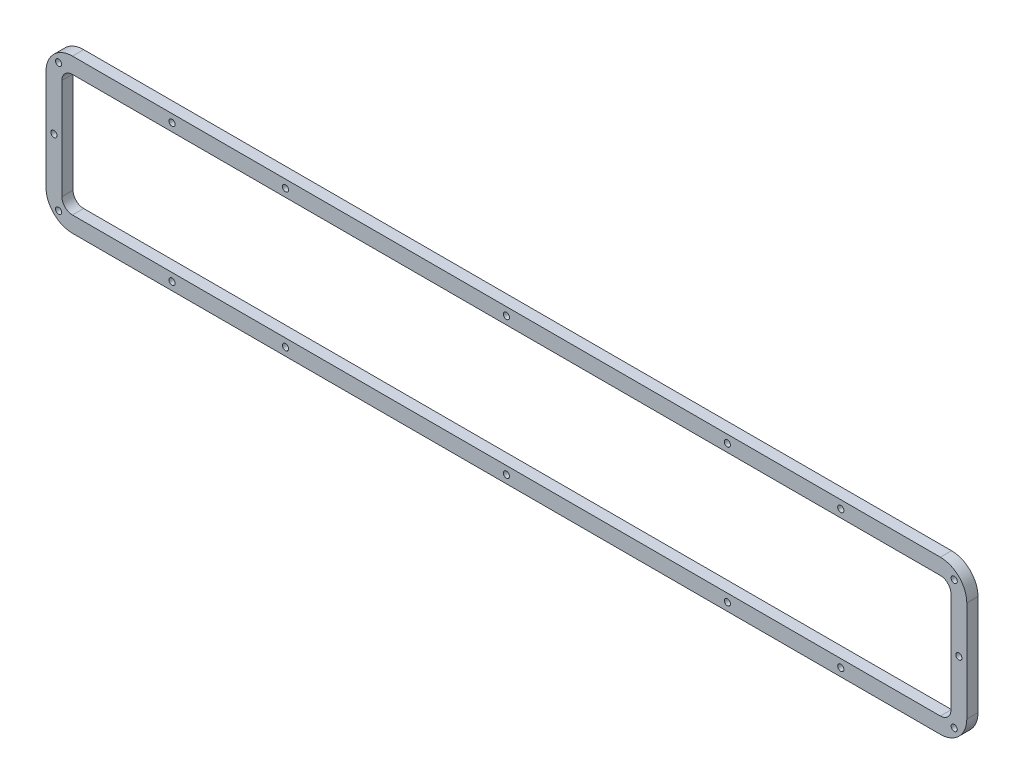
ISO-10303-21;
HEADER;
FILE_DESCRIPTION(('STEP AP214'),'2;1');
FILE_NAME('part.step','',(''),(''),'','','');
FILE_SCHEMA(('AUTOMOTIVE_DESIGN { 1 0 10303 214 1 1 1 1 }'));
ENDSEC;
DATA;
#1=APPLICATION_CONTEXT('core data for automotive mechanical design processes');
#2=APPLICATION_PROTOCOL_DEFINITION('international standard','automotive_design',2000,#1);
#3=PRODUCT_CONTEXT('',#1,'mechanical');
#4=PRODUCT('Part','Part','',(#3));
#5=PRODUCT_RELATED_PRODUCT_CATEGORY('part','',(#4));
#6=PRODUCT_DEFINITION_FORMATION('','',#4);
#7=PRODUCT_DEFINITION_CONTEXT('part definition',#1,'design');
#8=PRODUCT_DEFINITION('design','',#6,#7);
#9=PRODUCT_DEFINITION_SHAPE('','',#8);
#10=(LENGTH_UNIT() NAMED_UNIT(*) SI_UNIT(.MILLI.,.METRE.));
#11=(NAMED_UNIT(*) PLANE_ANGLE_UNIT() SI_UNIT($,.RADIAN.));
#12=(NAMED_UNIT(*) SI_UNIT($,.STERADIAN.) SOLID_ANGLE_UNIT());
#13=UNCERTAINTY_MEASURE_WITH_UNIT(LENGTH_MEASURE(1.E-05),#10,'distance_accuracy_value','');
#14=(GEOMETRIC_REPRESENTATION_CONTEXT(3) GLOBAL_UNCERTAINTY_ASSIGNED_CONTEXT((#13)) GLOBAL_UNIT_ASSIGNED_CONTEXT((#10,
#11,#12)) REPRESENTATION_CONTEXT('',''));
#15=CARTESIAN_POINT('',(0.,0.,0.));
#16=DIRECTION('',(0.,0.,1.));
#17=DIRECTION('',(1.,0.,0.));
#18=AXIS2_PLACEMENT_3D('',#15,#16,#17);
#19=CARTESIAN_POINT('',(-492.,-57.,12.7));
#20=DIRECTION('',(0.,0.,1.));
#21=DIRECTION('',(1.,0.,0.));
#22=AXIS2_PLACEMENT_3D('',#19,#20,#21);
#23=PLANE('',#22);
#24=CARTESIAN_POINT('',(513.,0.,12.7));
#25=DIRECTION('',(0.,0.,1.));
#26=DIRECTION('',(1.,0.,0.));
#27=AXIS2_PLACEMENT_3D('',#24,#25,#26);
#28=CIRCLE('',#27,3.50000000000008);
#29=CARTESIAN_POINT('',(516.5,0.,12.7));
#30=VERTEX_POINT('',#29);
#31=EDGE_CURVE('E474',#30,#30,#28,.T.);
#32=ORIENTED_EDGE('',*,*,#31,.F.);
#33=EDGE_LOOP('',(#32));
#34=FACE_BOUND('',#33,.T.);
#35=CARTESIAN_POINT('',(379.113961030679,-77.9999999999998,12.7));
#36=DIRECTION('',(0.,0.,1.));
#37=DIRECTION('',(1.,0.,0.));
#38=AXIS2_PLACEMENT_3D('',#35,#36,#37);
#39=CIRCLE('',#38,3.50000000000002);
#40=CARTESIAN_POINT('',(382.613961030679,-77.9999999999998,12.7));
#41=VERTEX_POINT('',#40);
#42=EDGE_CURVE('E471',#41,#41,#39,.T.);
#43=ORIENTED_EDGE('',*,*,#42,.F.);
#44=EDGE_LOOP('',(#43));
#45=FACE_BOUND('',#44,.T.);
#46=CARTESIAN_POINT('',(379.113961030679,78.0000000000001,12.7));
#47=DIRECTION('',(0.,0.,1.));
#48=DIRECTION('',(1.,0.,0.));
#49=AXIS2_PLACEMENT_3D('',#46,#47,#48);
#50=CIRCLE('',#49,3.50000000000002);
#51=CARTESIAN_POINT('',(382.613961030679,78.0000000000001,12.7));
#52=VERTEX_POINT('',#51);
#53=EDGE_CURVE('E468',#52,#52,#50,.T.);
#54=ORIENTED_EDGE('',*,*,#53,.F.);
#55=EDGE_LOOP('',(#54));
#56=FACE_BOUND('',#55,.T.);
#57=CARTESIAN_POINT('',(0.,78.,12.7));
#58=DIRECTION('',(0.,0.,1.));
#59=DIRECTION('',(1.,0.,0.));
#60=AXIS2_PLACEMENT_3D('',#57,#58,#59);
#61=CIRCLE('',#60,3.50000000000001);
#62=CARTESIAN_POINT('',(3.50000000000001,78.,12.7));
#63=VERTEX_POINT('',#62);
#64=EDGE_CURVE('E465',#63,#63,#61,.T.);
#65=ORIENTED_EDGE('',*,*,#64,.F.);
#66=EDGE_LOOP('',(#65));
#67=FACE_BOUND('',#66,.T.);
#68=CARTESIAN_POINT('',(0.,-77.9999999999999,12.7));
#69=DIRECTION('',(0.,0.,1.));
#70=DIRECTION('',(1.,0.,0.));
#71=AXIS2_PLACEMENT_3D('',#68,#69,#70);
#72=CIRCLE('',#71,3.50000000000001);
#73=CARTESIAN_POINT('',(3.50000000000001,-77.9999999999999,12.7));
#74=VERTEX_POINT('',#73);
#75=EDGE_CURVE('E462',#74,#74,#72,.T.);
#76=ORIENTED_EDGE('',*,*,#75,.F.);
#77=EDGE_LOOP('',(#76));
#78=FACE_BOUND('',#77,.T.);
#79=CARTESIAN_POINT('',(-379.113961030679,-77.9999999999999,12.7));
#80=DIRECTION('',(0.,0.,1.));
#81=DIRECTION('',(1.,0.,0.));
#82=AXIS2_PLACEMENT_3D('',#79,#80,#81);
#83=CIRCLE('',#82,3.50000000000002);
#84=CARTESIAN_POINT('',(-375.613961030679,-77.9999999999999,12.7));
#85=VERTEX_POINT('',#84);
#86=EDGE_CURVE('E459',#85,#85,#83,.T.);
#87=ORIENTED_EDGE('',*,*,#86,.F.);
#88=EDGE_LOOP('',(#87));
#89=FACE_BOUND('',#88,.T.);
#90=CARTESIAN_POINT('',(-513.,0.,12.7));
#91=DIRECTION('',(0.,0.,1.));
#92=DIRECTION('',(1.,0.,0.));
#93=AXIS2_PLACEMENT_3D('',#90,#91,#92);
#94=CIRCLE('',#93,3.49999999999996);
#95=CARTESIAN_POINT('',(-509.5,0.,12.7));
#96=VERTEX_POINT('',#95);
#97=EDGE_CURVE('E427',#96,#96,#94,.T.);
#98=ORIENTED_EDGE('',*,*,#97,.F.);
#99=EDGE_LOOP('',(#98));
#100=FACE_BOUND('',#99,.T.);
#101=CARTESIAN_POINT('',(-379.113961030679,78.,12.7));
#102=DIRECTION('',(0.,0.,1.));
#103=DIRECTION('',(1.,0.,0.));
#104=AXIS2_PLACEMENT_3D('',#101,#102,#103);
#105=CIRCLE('',#104,3.50000000000002);
#106=CARTESIAN_POINT('',(-375.613961030679,78.,12.7));
#107=VERTEX_POINT('',#106);
#108=EDGE_CURVE('E436',#107,#107,#105,.T.);
#109=ORIENTED_EDGE('',*,*,#108,.F.);
#110=EDGE_LOOP('',(#109));
#111=FACE_BOUND('',#110,.T.);
#112=CARTESIAN_POINT('',(-507.727922061358,-72.7279220613577,12.7));
#113=DIRECTION('',(0.,0.,1.));
#114=DIRECTION('',(1.,0.,0.));
#115=AXIS2_PLACEMENT_3D('',#112,#113,#114);
#116=CIRCLE('',#115,3.50000000000008);
#117=CARTESIAN_POINT('',(-504.227922061358,-72.7279220613577,12.7));
#118=VERTEX_POINT('',#117);
#119=EDGE_CURVE('E500',#118,#118,#116,.T.);
#120=ORIENTED_EDGE('',*,*,#119,.F.);
#121=EDGE_LOOP('',(#120));
#122=FACE_BOUND('',#121,.T.);
#123=CARTESIAN_POINT('',(-250.5,-77.9999999999999,12.7));
#124=DIRECTION('',(0.,0.,1.));
#125=DIRECTION('',(1.,0.,0.));
#126=AXIS2_PLACEMENT_3D('',#123,#124,#125);
#127=CIRCLE('',#126,3.50000000000002);
#128=CARTESIAN_POINT('',(-247.,-77.9999999999999,12.7));
#129=VERTEX_POINT('',#128);
#130=EDGE_CURVE('E506',#129,#129,#127,.T.);
#131=ORIENTED_EDGE('',*,*,#130,.F.);
#132=EDGE_LOOP('',(#131));
#133=FACE_BOUND('',#132,.T.);
#134=CARTESIAN_POINT('',(-250.5,78.,12.7));
#135=DIRECTION('',(0.,0.,1.));
#136=DIRECTION('',(1.,0.,0.));
#137=AXIS2_PLACEMENT_3D('',#134,#135,#136);
#138=CIRCLE('',#137,3.50000000000002);
#139=CARTESIAN_POINT('',(-247.,78.,12.7));
#140=VERTEX_POINT('',#139);
#141=EDGE_CURVE('E512',#140,#140,#138,.T.);
#142=ORIENTED_EDGE('',*,*,#141,.F.);
#143=EDGE_LOOP('',(#142));
#144=FACE_BOUND('',#143,.T.);
#145=CARTESIAN_POINT('',(250.5,78.,12.7));
#146=DIRECTION('',(0.,0.,1.));
#147=DIRECTION('',(1.,0.,0.));
#148=AXIS2_PLACEMENT_3D('',#145,#146,#147);
#149=CIRCLE('',#148,3.50000000000002);
#150=CARTESIAN_POINT('',(254.,78.,12.7));
#151=VERTEX_POINT('',#150);
#152=EDGE_CURVE('E487',#151,#151,#149,.T.);
#153=ORIENTED_EDGE('',*,*,#152,.F.);
#154=EDGE_LOOP('',(#153));
#155=FACE_BOUND('',#154,.T.);
#156=CARTESIAN_POINT('',(507.727922061358,-72.7279220613577,12.7));
#157=DIRECTION('',(0.,0.,1.));
#158=DIRECTION('',(1.,0.,0.));
#159=AXIS2_PLACEMENT_3D('',#156,#157,#158);
#160=CIRCLE('',#159,3.50000000000019);
#161=CARTESIAN_POINT('',(511.227922061358,-72.7279220613577,12.7));
#162=VERTEX_POINT('',#161);
#163=EDGE_CURVE('E477',#162,#162,#160,.T.);
#164=ORIENTED_EDGE('',*,*,#163,.F.);
#165=EDGE_LOOP('',(#164));
#166=FACE_BOUND('',#165,.T.);
#167=CARTESIAN_POINT('',(507.727922061358,72.7279220613578,12.7));
#168=DIRECTION('',(0.,0.,1.));
#169=DIRECTION('',(1.,0.,0.));
#170=AXIS2_PLACEMENT_3D('',#167,#168,#169);
#171=CIRCLE('',#170,3.50000000000019);
#172=CARTESIAN_POINT('',(511.227922061358,72.7279220613578,12.7));
#173=VERTEX_POINT('',#172);
#174=EDGE_CURVE('E481',#173,#173,#171,.T.);
#175=ORIENTED_EDGE('',*,*,#174,.F.);
#176=EDGE_LOOP('',(#175));
#177=FACE_BOUND('',#176,.T.);
#178=CARTESIAN_POINT('',(250.5,-77.9999999999999,12.7));
#179=DIRECTION('',(0.,0.,1.));
#180=DIRECTION('',(1.,0.,0.));
#181=AXIS2_PLACEMENT_3D('',#178,#179,#180);
#182=CIRCLE('',#181,3.50000000000002);
#183=CARTESIAN_POINT('',(254.,-77.9999999999999,12.7));
#184=VERTEX_POINT('',#183);
#185=EDGE_CURVE('E488',#184,#184,#182,.T.);
#186=ORIENTED_EDGE('',*,*,#185,.F.);
#187=EDGE_LOOP('',(#186));
#188=FACE_BOUND('',#187,.T.);
#189=CARTESIAN_POINT('',(-507.727922061358,72.7279220613578,12.7));
#190=DIRECTION('',(0.,0.,1.));
#191=DIRECTION('',(1.,0.,0.));
#192=AXIS2_PLACEMENT_3D('',#189,#190,#191);
#193=CIRCLE('',#192,3.50000000000008);
#194=CARTESIAN_POINT('',(-504.227922061358,72.7279220613578,12.7));
#195=VERTEX_POINT('',#194);
#196=EDGE_CURVE('E499',#195,#195,#193,.T.);
#197=ORIENTED_EDGE('',*,*,#196,.F.);
#198=EDGE_LOOP('',(#197));
#199=FACE_BOUND('',#198,.T.);
#200=CARTESIAN_POINT('',(-492.,-57.,12.7));
#201=DIRECTION('',(0.,0.,1.));
#202=DIRECTION('',(1.,0.,0.));
#203=AXIS2_PLACEMENT_3D('',#200,#201,#202);
#204=CIRCLE('',#203,30.0000000000001);
#205=CARTESIAN_POINT('',(-522.,-57.,12.7));
#206=VERTEX_POINT('',#205);
#207=CARTESIAN_POINT('',(-492.,-87.,12.7));
#208=VERTEX_POINT('',#207);
#209=EDGE_CURVE('E213',#206,#208,#204,.T.);
#210=ORIENTED_EDGE('',*,*,#209,.T.);
#211=DIRECTION('',(1.,0.,0.));
#212=VECTOR('',#211,1.);
#213=CARTESIAN_POINT('',(-492.,-87.,12.7));
#214=LINE('',#213,#212);
#215=CARTESIAN_POINT('',(492.,-87.,12.7));
#216=VERTEX_POINT('',#215);
#217=EDGE_CURVE('E216',#208,#216,#214,.T.);
#218=ORIENTED_EDGE('',*,*,#217,.T.);
#219=CARTESIAN_POINT('',(492.,-57.,12.7));
#220=DIRECTION('',(0.,0.,1.));
#221=DIRECTION('',(1.,0.,0.));
#222=AXIS2_PLACEMENT_3D('',#219,#220,#221);
#223=CIRCLE('',#222,30.);
#224=CARTESIAN_POINT('',(522.,-57.,12.7));
#225=VERTEX_POINT('',#224);
#226=EDGE_CURVE('E219',#216,#225,#223,.T.);
#227=ORIENTED_EDGE('',*,*,#226,.T.);
#228=DIRECTION('',(0.,1.,0.));
#229=VECTOR('',#228,1.);
#230=CARTESIAN_POINT('',(522.,-57.,12.7));
#231=LINE('',#230,#229);
#232=CARTESIAN_POINT('',(522.,57.,12.7));
#233=VERTEX_POINT('',#232);
#234=EDGE_CURVE('E221',#225,#233,#231,.T.);
#235=ORIENTED_EDGE('',*,*,#234,.T.);
#236=CARTESIAN_POINT('',(492.,57.,12.7));
#237=DIRECTION('',(0.,0.,1.));
#238=DIRECTION('',(1.,0.,0.));
#239=AXIS2_PLACEMENT_3D('',#236,#237,#238);
#240=CIRCLE('',#239,30.);
#241=CARTESIAN_POINT('',(492.,87.,12.7));
#242=VERTEX_POINT('',#241);
#243=EDGE_CURVE('E223',#233,#242,#240,.T.);
#244=ORIENTED_EDGE('',*,*,#243,.T.);
#245=DIRECTION('',(-1.,0.,0.));
#246=VECTOR('',#245,1.);
#247=CARTESIAN_POINT('',(492.,87.,12.7));
#248=LINE('',#247,#246);
#249=CARTESIAN_POINT('',(-492.,87.,12.7));
#250=VERTEX_POINT('',#249);
#251=EDGE_CURVE('E225',#242,#250,#248,.T.);
#252=ORIENTED_EDGE('',*,*,#251,.T.);
#253=CARTESIAN_POINT('',(-492.,57.,12.7));
#254=DIRECTION('',(0.,0.,1.));
#255=DIRECTION('',(1.,0.,0.));
#256=AXIS2_PLACEMENT_3D('',#253,#254,#255);
#257=CIRCLE('',#256,30.);
#258=CARTESIAN_POINT('',(-522.,57.,12.7));
#259=VERTEX_POINT('',#258);
#260=EDGE_CURVE('E227',#250,#259,#257,.T.);
#261=ORIENTED_EDGE('',*,*,#260,.T.);
#262=DIRECTION('',(0.,-1.,0.));
#263=VECTOR('',#262,1.);
#264=CARTESIAN_POINT('',(-522.,57.,12.7));
#265=LINE('',#264,#263);
#266=EDGE_CURVE('E229',#259,#206,#265,.T.);
#267=ORIENTED_EDGE('',*,*,#266,.T.);
#268=EDGE_LOOP('',(#210,#218,#227,#235,#244,#252,#261,#267));
#269=FACE_BOUND('',#268,.T.);
#270=DIRECTION('',(1.,0.,0.));
#271=VECTOR('',#270,1.);
#272=CARTESIAN_POINT('',(-492.,-69.,12.7));
#273=LINE('',#272,#271);
#274=CARTESIAN_POINT('',(-492.,-69.,12.7));
#275=VERTEX_POINT('',#274);
#276=CARTESIAN_POINT('',(492.,-69.,12.7));
#277=VERTEX_POINT('',#276);
#278=EDGE_CURVE('E154',#275,#277,#273,.T.);
#279=ORIENTED_EDGE('',*,*,#278,.F.);
#280=CARTESIAN_POINT('',(-492.,-57.,12.7));
#281=DIRECTION('',(0.,0.,1.));
#282=DIRECTION('',(1.,0.,0.));
#283=AXIS2_PLACEMENT_3D('',#280,#281,#282);
#284=CIRCLE('',#283,12.);
#285=CARTESIAN_POINT('',(-504.,-57.,12.7));
#286=VERTEX_POINT('',#285);
#287=EDGE_CURVE('E146',#286,#275,#284,.T.);
#288=ORIENTED_EDGE('',*,*,#287,.F.);
#289=DIRECTION('',(0.,-1.,0.));
#290=VECTOR('',#289,1.);
#291=CARTESIAN_POINT('',(-504.,57.,12.7));
#292=LINE('',#291,#290);
#293=CARTESIAN_POINT('',(-504.,57.,12.7));
#294=VERTEX_POINT('',#293);
#295=EDGE_CURVE('E180',#294,#286,#292,.T.);
#296=ORIENTED_EDGE('',*,*,#295,.F.);
#297=CARTESIAN_POINT('',(-492.,57.,12.7));
#298=DIRECTION('',(0.,0.,1.));
#299=DIRECTION('',(1.,0.,0.));
#300=AXIS2_PLACEMENT_3D('',#297,#298,#299);
#301=CIRCLE('',#300,12.);
#302=CARTESIAN_POINT('',(-492.,69.,12.7));
#303=VERTEX_POINT('',#302);
#304=EDGE_CURVE('E178',#303,#294,#301,.T.);
#305=ORIENTED_EDGE('',*,*,#304,.F.);
#306=DIRECTION('',(-1.,0.,0.));
#307=VECTOR('',#306,1.);
#308=CARTESIAN_POINT('',(492.,69.,12.7));
#309=LINE('',#308,#307);
#310=CARTESIAN_POINT('',(492.,69.,12.7));
#311=VERTEX_POINT('',#310);
#312=EDGE_CURVE('E176',#311,#303,#309,.T.);
#313=ORIENTED_EDGE('',*,*,#312,.F.);
#314=CARTESIAN_POINT('',(492.,57.,12.7));
#315=DIRECTION('',(0.,0.,1.));
#316=DIRECTION('',(1.,0.,0.));
#317=AXIS2_PLACEMENT_3D('',#314,#315,#316);
#318=CIRCLE('',#317,12.0000000000001);
#319=CARTESIAN_POINT('',(504.,57.,12.7));
#320=VERTEX_POINT('',#319);
#321=EDGE_CURVE('E174',#320,#311,#318,.T.);
#322=ORIENTED_EDGE('',*,*,#321,.F.);
#323=DIRECTION('',(0.,1.,0.));
#324=VECTOR('',#323,1.);
#325=CARTESIAN_POINT('',(504.,-57.,12.7));
#326=LINE('',#325,#324);
#327=CARTESIAN_POINT('',(504.,-57.,12.7));
#328=VERTEX_POINT('',#327);
#329=EDGE_CURVE('E169',#328,#320,#326,.T.);
#330=ORIENTED_EDGE('',*,*,#329,.F.);
#331=CARTESIAN_POINT('',(492.,-57.,12.7));
#332=DIRECTION('',(0.,0.,1.));
#333=DIRECTION('',(1.,0.,0.));
#334=AXIS2_PLACEMENT_3D('',#331,#332,#333);
#335=CIRCLE('',#334,12.);
#336=EDGE_CURVE('E167',#277,#328,#335,.T.);
#337=ORIENTED_EDGE('',*,*,#336,.F.);
#338=EDGE_LOOP('',(#279,#288,#296,#305,#313,#322,#330,#337));
#339=FACE_BOUND('',#338,.T.);
#340=ADVANCED_FACE('F33',(#34,#45,#56,#67,#78,#89,#100,#111,#122,#133,#144,#155,#166,#177,#188,
#199,#269,#339),#23,.T.);
#341=CARTESIAN_POINT('',(-492.,-57.,0.));
#342=DIRECTION('',(0.,0.,1.));
#343=DIRECTION('',(1.,0.,0.));
#344=AXIS2_PLACEMENT_3D('',#341,#342,#343);
#345=PLANE('',#344);
#346=CARTESIAN_POINT('',(513.,0.,0.));
#347=DIRECTION('',(0.,0.,1.));
#348=DIRECTION('',(1.,0.,0.));
#349=AXIS2_PLACEMENT_3D('',#346,#347,#348);
#350=CIRCLE('',#349,3.50000000000008);
#351=CARTESIAN_POINT('',(516.5,0.,0.));
#352=VERTEX_POINT('',#351);
#353=EDGE_CURVE('E453',#352,#352,#350,.T.);
#354=ORIENTED_EDGE('',*,*,#353,.T.);
#355=EDGE_LOOP('',(#354));
#356=FACE_BOUND('',#355,.T.);
#357=CARTESIAN_POINT('',(379.113961030679,-77.9999999999998,0.));
#358=DIRECTION('',(0.,0.,1.));
#359=DIRECTION('',(1.,0.,0.));
#360=AXIS2_PLACEMENT_3D('',#357,#358,#359);
#361=CIRCLE('',#360,3.50000000000002);
#362=CARTESIAN_POINT('',(382.613961030679,-77.9999999999998,0.));
#363=VERTEX_POINT('',#362);
#364=EDGE_CURVE('E450',#363,#363,#361,.T.);
#365=ORIENTED_EDGE('',*,*,#364,.T.);
#366=EDGE_LOOP('',(#365));
#367=FACE_BOUND('',#366,.T.);
#368=CARTESIAN_POINT('',(379.113961030679,78.0000000000001,0.));
#369=DIRECTION('',(0.,0.,1.));
#370=DIRECTION('',(1.,0.,0.));
#371=AXIS2_PLACEMENT_3D('',#368,#369,#370);
#372=CIRCLE('',#371,3.50000000000002);
#373=CARTESIAN_POINT('',(382.613961030679,78.0000000000001,0.));
#374=VERTEX_POINT('',#373);
#375=EDGE_CURVE('E447',#374,#374,#372,.T.);
#376=ORIENTED_EDGE('',*,*,#375,.T.);
#377=EDGE_LOOP('',(#376));
#378=FACE_BOUND('',#377,.T.);
#379=CARTESIAN_POINT('',(0.,78.,0.));
#380=DIRECTION('',(0.,0.,1.));
#381=DIRECTION('',(1.,0.,0.));
#382=AXIS2_PLACEMENT_3D('',#379,#380,#381);
#383=CIRCLE('',#382,3.50000000000001);
#384=CARTESIAN_POINT('',(3.50000000000001,78.,0.));
#385=VERTEX_POINT('',#384);
#386=EDGE_CURVE('E444',#385,#385,#383,.T.);
#387=ORIENTED_EDGE('',*,*,#386,.T.);
#388=EDGE_LOOP('',(#387));
#389=FACE_BOUND('',#388,.T.);
#390=CARTESIAN_POINT('',(0.,-77.9999999999999,0.));
#391=DIRECTION('',(0.,0.,1.));
#392=DIRECTION('',(1.,0.,0.));
#393=AXIS2_PLACEMENT_3D('',#390,#391,#392);
#394=CIRCLE('',#393,3.50000000000001);
#395=CARTESIAN_POINT('',(3.50000000000001,-77.9999999999999,0.));
#396=VERTEX_POINT('',#395);
#397=EDGE_CURVE('E439',#396,#396,#394,.T.);
#398=ORIENTED_EDGE('',*,*,#397,.T.);
#399=EDGE_LOOP('',(#398));
#400=FACE_BOUND('',#399,.T.);
#401=CARTESIAN_POINT('',(-379.113961030679,-77.9999999999999,0.));
#402=DIRECTION('',(0.,0.,1.));
#403=DIRECTION('',(1.,0.,0.));
#404=AXIS2_PLACEMENT_3D('',#401,#402,#403);
#405=CIRCLE('',#404,3.50000000000002);
#406=CARTESIAN_POINT('',(-375.613961030679,-77.9999999999999,0.));
#407=VERTEX_POINT('',#406);
#408=EDGE_CURVE('E433',#407,#407,#405,.T.);
#409=ORIENTED_EDGE('',*,*,#408,.T.);
#410=EDGE_LOOP('',(#409));
#411=FACE_BOUND('',#410,.T.);
#412=CARTESIAN_POINT('',(-513.,0.,0.));
#413=DIRECTION('',(0.,0.,1.));
#414=DIRECTION('',(1.,0.,0.));
#415=AXIS2_PLACEMENT_3D('',#412,#413,#414);
#416=CIRCLE('',#415,3.49999999999996);
#417=CARTESIAN_POINT('',(-509.5,0.,0.));
#418=VERTEX_POINT('',#417);
#419=EDGE_CURVE('E430',#418,#418,#416,.T.);
#420=ORIENTED_EDGE('',*,*,#419,.T.);
#421=EDGE_LOOP('',(#420));
#422=FACE_BOUND('',#421,.T.);
#423=CARTESIAN_POINT('',(-379.113961030679,78.,0.));
#424=DIRECTION('',(0.,0.,1.));
#425=DIRECTION('',(1.,0.,0.));
#426=AXIS2_PLACEMENT_3D('',#423,#424,#425);
#427=CIRCLE('',#426,3.50000000000002);
#428=CARTESIAN_POINT('',(-375.613961030679,78.,0.));
#429=VERTEX_POINT('',#428);
#430=EDGE_CURVE('E432',#429,#429,#427,.T.);
#431=ORIENTED_EDGE('',*,*,#430,.T.);
#432=EDGE_LOOP('',(#431));
#433=FACE_BOUND('',#432,.T.);
#434=CARTESIAN_POINT('',(-507.727922061358,-72.7279220613577,0.));
#435=DIRECTION('',(0.,0.,1.));
#436=DIRECTION('',(1.,0.,0.));
#437=AXIS2_PLACEMENT_3D('',#434,#435,#436);
#438=CIRCLE('',#437,3.50000000000008);
#439=CARTESIAN_POINT('',(-504.227922061358,-72.7279220613577,0.));
#440=VERTEX_POINT('',#439);
#441=EDGE_CURVE('E496',#440,#440,#438,.T.);
#442=ORIENTED_EDGE('',*,*,#441,.T.);
#443=EDGE_LOOP('',(#442));
#444=FACE_BOUND('',#443,.T.);
#445=CARTESIAN_POINT('',(-250.5,-77.9999999999999,0.));
#446=DIRECTION('',(0.,0.,1.));
#447=DIRECTION('',(1.,0.,0.));
#448=AXIS2_PLACEMENT_3D('',#445,#446,#447);
#449=CIRCLE('',#448,3.50000000000002);
#450=CARTESIAN_POINT('',(-247.,-77.9999999999999,0.));
#451=VERTEX_POINT('',#450);
#452=EDGE_CURVE('E503',#451,#451,#449,.T.);
#453=ORIENTED_EDGE('',*,*,#452,.T.);
#454=EDGE_LOOP('',(#453));
#455=FACE_BOUND('',#454,.T.);
#456=CARTESIAN_POINT('',(-250.5,78.,0.));
#457=DIRECTION('',(0.,0.,1.));
#458=DIRECTION('',(1.,0.,0.));
#459=AXIS2_PLACEMENT_3D('',#456,#457,#458);
#460=CIRCLE('',#459,3.50000000000002);
#461=CARTESIAN_POINT('',(-247.,78.,0.));
#462=VERTEX_POINT('',#461);
#463=EDGE_CURVE('E509',#462,#462,#460,.T.);
#464=ORIENTED_EDGE('',*,*,#463,.T.);
#465=EDGE_LOOP('',(#464));
#466=FACE_BOUND('',#465,.T.);
#467=CARTESIAN_POINT('',(250.5,78.,0.));
#468=DIRECTION('',(0.,0.,1.));
#469=DIRECTION('',(1.,0.,0.));
#470=AXIS2_PLACEMENT_3D('',#467,#468,#469);
#471=CIRCLE('',#470,3.50000000000002);
#472=CARTESIAN_POINT('',(254.,78.,0.));
#473=VERTEX_POINT('',#472);
#474=EDGE_CURVE('E515',#473,#473,#471,.T.);
#475=ORIENTED_EDGE('',*,*,#474,.T.);
#476=EDGE_LOOP('',(#475));
#477=FACE_BOUND('',#476,.T.);
#478=CARTESIAN_POINT('',(507.727922061358,-72.7279220613577,0.));
#479=DIRECTION('',(0.,0.,1.));
#480=DIRECTION('',(1.,0.,0.));
#481=AXIS2_PLACEMENT_3D('',#478,#479,#480);
#482=CIRCLE('',#481,3.50000000000019);
#483=CARTESIAN_POINT('',(511.227922061358,-72.7279220613577,0.));
#484=VERTEX_POINT('',#483);
#485=EDGE_CURVE('E478',#484,#484,#482,.T.);
#486=ORIENTED_EDGE('',*,*,#485,.T.);
#487=EDGE_LOOP('',(#486));
#488=FACE_BOUND('',#487,.T.);
#489=CARTESIAN_POINT('',(507.727922061358,72.7279220613578,0.));
#490=DIRECTION('',(0.,0.,1.));
#491=DIRECTION('',(1.,0.,0.));
#492=AXIS2_PLACEMENT_3D('',#489,#490,#491);
#493=CIRCLE('',#492,3.50000000000019);
#494=CARTESIAN_POINT('',(511.227922061358,72.7279220613578,0.));
#495=VERTEX_POINT('',#494);
#496=EDGE_CURVE('E491',#495,#495,#493,.T.);
#497=ORIENTED_EDGE('',*,*,#496,.T.);
#498=EDGE_LOOP('',(#497));
#499=FACE_BOUND('',#498,.T.);
#500=CARTESIAN_POINT('',(250.5,-77.9999999999999,0.));
#501=DIRECTION('',(0.,0.,1.));
#502=DIRECTION('',(1.,0.,0.));
#503=AXIS2_PLACEMENT_3D('',#500,#501,#502);
#504=CIRCLE('',#503,3.50000000000002);
#505=CARTESIAN_POINT('',(254.,-77.9999999999999,0.));
#506=VERTEX_POINT('',#505);
#507=EDGE_CURVE('E484',#506,#506,#504,.T.);
#508=ORIENTED_EDGE('',*,*,#507,.T.);
#509=EDGE_LOOP('',(#508));
#510=FACE_BOUND('',#509,.T.);
#511=CARTESIAN_POINT('',(-507.727922061358,72.7279220613578,0.));
#512=DIRECTION('',(0.,0.,1.));
#513=DIRECTION('',(1.,0.,0.));
#514=AXIS2_PLACEMENT_3D('',#511,#512,#513);
#515=CIRCLE('',#514,3.50000000000008);
#516=CARTESIAN_POINT('',(-504.227922061358,72.7279220613578,0.));
#517=VERTEX_POINT('',#516);
#518=EDGE_CURVE('E183',#517,#517,#515,.T.);
#519=ORIENTED_EDGE('',*,*,#518,.T.);
#520=EDGE_LOOP('',(#519));
#521=FACE_BOUND('',#520,.T.);
#522=CARTESIAN_POINT('',(-492.,-57.,0.));
#523=DIRECTION('',(0.,0.,1.));
#524=DIRECTION('',(1.,0.,0.));
#525=AXIS2_PLACEMENT_3D('',#522,#523,#524);
#526=CIRCLE('',#525,30.0000000000001);
#527=CARTESIAN_POINT('',(-522.,-57.,0.));
#528=VERTEX_POINT('',#527);
#529=CARTESIAN_POINT('',(-492.,-87.,0.));
#530=VERTEX_POINT('',#529);
#531=EDGE_CURVE('E162',#528,#530,#526,.T.);
#532=ORIENTED_EDGE('',*,*,#531,.F.);
#533=DIRECTION('',(0.,-1.,0.));
#534=VECTOR('',#533,1.);
#535=CARTESIAN_POINT('',(-522.,57.,0.));
#536=LINE('',#535,#534);
#537=CARTESIAN_POINT('',(-522.,57.,0.));
#538=VERTEX_POINT('',#537);
#539=EDGE_CURVE('E217',#538,#528,#536,.T.);
#540=ORIENTED_EDGE('',*,*,#539,.F.);
#541=CARTESIAN_POINT('',(-492.,57.,0.));
#542=DIRECTION('',(0.,0.,1.));
#543=DIRECTION('',(1.,0.,0.));
#544=AXIS2_PLACEMENT_3D('',#541,#542,#543);
#545=CIRCLE('',#544,30.);
#546=CARTESIAN_POINT('',(-492.,87.,0.));
#547=VERTEX_POINT('',#546);
#548=EDGE_CURVE('E244',#547,#538,#545,.T.);
#549=ORIENTED_EDGE('',*,*,#548,.F.);
#550=DIRECTION('',(-1.,0.,0.));
#551=VECTOR('',#550,1.);
#552=CARTESIAN_POINT('',(492.,87.,0.));
#553=LINE('',#552,#551);
#554=CARTESIAN_POINT('',(492.,87.,0.));
#555=VERTEX_POINT('',#554);
#556=EDGE_CURVE('E242',#555,#547,#553,.T.);
#557=ORIENTED_EDGE('',*,*,#556,.F.);
#558=CARTESIAN_POINT('',(492.,57.,0.));
#559=DIRECTION('',(0.,0.,1.));
#560=DIRECTION('',(1.,0.,0.));
#561=AXIS2_PLACEMENT_3D('',#558,#559,#560);
#562=CIRCLE('',#561,30.);
#563=CARTESIAN_POINT('',(522.,57.,0.));
#564=VERTEX_POINT('',#563);
#565=EDGE_CURVE('E240',#564,#555,#562,.T.);
#566=ORIENTED_EDGE('',*,*,#565,.F.);
#567=DIRECTION('',(0.,1.,0.));
#568=VECTOR('',#567,1.);
#569=CARTESIAN_POINT('',(522.,-57.,0.));
#570=LINE('',#569,#568);
#571=CARTESIAN_POINT('',(522.,-57.,0.));
#572=VERTEX_POINT('',#571);
#573=EDGE_CURVE('E238',#572,#564,#570,.T.);
#574=ORIENTED_EDGE('',*,*,#573,.F.);
#575=CARTESIAN_POINT('',(492.,-57.,0.));
#576=DIRECTION('',(0.,0.,1.));
#577=DIRECTION('',(1.,0.,0.));
#578=AXIS2_PLACEMENT_3D('',#575,#576,#577);
#579=CIRCLE('',#578,30.);
#580=CARTESIAN_POINT('',(492.,-87.,0.));
#581=VERTEX_POINT('',#580);
#582=EDGE_CURVE('E236',#581,#572,#579,.T.);
#583=ORIENTED_EDGE('',*,*,#582,.F.);
#584=DIRECTION('',(1.,0.,0.));
#585=VECTOR('',#584,1.);
#586=CARTESIAN_POINT('',(-492.,-87.,0.));
#587=LINE('',#586,#585);
#588=EDGE_CURVE('E234',#530,#581,#587,.T.);
#589=ORIENTED_EDGE('',*,*,#588,.F.);
#590=EDGE_LOOP('',(#532,#540,#549,#557,#566,#574,#583,#589));
#591=FACE_BOUND('',#590,.T.);
#592=CARTESIAN_POINT('',(-492.,-57.,0.));
#593=DIRECTION('',(0.,0.,1.));
#594=DIRECTION('',(1.,0.,0.));
#595=AXIS2_PLACEMENT_3D('',#592,#593,#594);
#596=CIRCLE('',#595,12.);
#597=CARTESIAN_POINT('',(-504.,-57.,0.));
#598=VERTEX_POINT('',#597);
#599=CARTESIAN_POINT('',(-492.,-69.,0.));
#600=VERTEX_POINT('',#599);
#601=EDGE_CURVE('E56',#598,#600,#596,.T.);
#602=ORIENTED_EDGE('',*,*,#601,.T.);
#603=DIRECTION('',(1.,0.,0.));
#604=VECTOR('',#603,1.);
#605=CARTESIAN_POINT('',(-492.,-69.,0.));
#606=LINE('',#605,#604);
#607=CARTESIAN_POINT('',(492.,-69.,0.));
#608=VERTEX_POINT('',#607);
#609=EDGE_CURVE('E161',#600,#608,#606,.T.);
#610=ORIENTED_EDGE('',*,*,#609,.T.);
#611=CARTESIAN_POINT('',(492.,-57.,0.));
#612=DIRECTION('',(0.,0.,1.));
#613=DIRECTION('',(1.,0.,0.));
#614=AXIS2_PLACEMENT_3D('',#611,#612,#613);
#615=CIRCLE('',#614,12.);
#616=CARTESIAN_POINT('',(504.,-57.,0.));
#617=VERTEX_POINT('',#616);
#618=EDGE_CURVE('E185',#608,#617,#615,.T.);
#619=ORIENTED_EDGE('',*,*,#618,.T.);
#620=DIRECTION('',(0.,1.,0.));
#621=VECTOR('',#620,1.);
#622=CARTESIAN_POINT('',(504.,-57.,0.));
#623=LINE('',#622,#621);
#624=CARTESIAN_POINT('',(504.,57.,0.));
#625=VERTEX_POINT('',#624);
#626=EDGE_CURVE('E188',#617,#625,#623,.T.);
#627=ORIENTED_EDGE('',*,*,#626,.T.);
#628=CARTESIAN_POINT('',(492.,57.,0.));
#629=DIRECTION('',(0.,0.,1.));
#630=DIRECTION('',(1.,0.,0.));
#631=AXIS2_PLACEMENT_3D('',#628,#629,#630);
#632=CIRCLE('',#631,12.0000000000001);
#633=CARTESIAN_POINT('',(492.,69.,0.));
#634=VERTEX_POINT('',#633);
#635=EDGE_CURVE('E191',#625,#634,#632,.T.);
#636=ORIENTED_EDGE('',*,*,#635,.T.);
#637=DIRECTION('',(-1.,0.,0.));
#638=VECTOR('',#637,1.);
#639=CARTESIAN_POINT('',(492.,69.,0.));
#640=LINE('',#639,#638);
#641=CARTESIAN_POINT('',(-492.,69.,0.));
#642=VERTEX_POINT('',#641);
#643=EDGE_CURVE('E194',#634,#642,#640,.T.);
#644=ORIENTED_EDGE('',*,*,#643,.T.);
#645=CARTESIAN_POINT('',(-492.,57.,0.));
#646=DIRECTION('',(0.,0.,1.));
#647=DIRECTION('',(1.,0.,0.));
#648=AXIS2_PLACEMENT_3D('',#645,#646,#647);
#649=CIRCLE('',#648,12.);
#650=CARTESIAN_POINT('',(-504.,57.,0.));
#651=VERTEX_POINT('',#650);
#652=EDGE_CURVE('E197',#642,#651,#649,.T.);
#653=ORIENTED_EDGE('',*,*,#652,.T.);
#654=DIRECTION('',(0.,-1.,0.));
#655=VECTOR('',#654,1.);
#656=CARTESIAN_POINT('',(-504.,57.,0.));
#657=LINE('',#656,#655);
#658=EDGE_CURVE('E155',#651,#598,#657,.T.);
#659=ORIENTED_EDGE('',*,*,#658,.T.);
#660=EDGE_LOOP('',(#602,#610,#619,#627,#636,#644,#653,#659));
#661=FACE_BOUND('',#660,.T.);
#662=ADVANCED_FACE('F274',(#356,#367,#378,#389,#400,#411,#422,#433,#444,#455,#466,#477,#488,
#499,#510,#521,#591,#661),#345,.F.);
#663=CARTESIAN_POINT('',(-492.,-57.,12.7));
#664=DIRECTION('',(0.,0.,-1.));
#665=DIRECTION('',(-1.,0.,0.));
#666=AXIS2_PLACEMENT_3D('',#663,#664,#665);
#667=CYLINDRICAL_SURFACE('',#666,30.0000000000001);
#668=ORIENTED_EDGE('',*,*,#531,.T.);
#669=DIRECTION('',(0.,0.,-1.));
#670=VECTOR('',#669,1.);
#671=CARTESIAN_POINT('',(-492.,-87.,12.7));
#672=LINE('',#671,#670);
#673=EDGE_CURVE('E11',#208,#530,#672,.T.);
#674=ORIENTED_EDGE('',*,*,#673,.F.);
#675=ORIENTED_EDGE('',*,*,#209,.F.);
#676=DIRECTION('',(0.,0.,-1.));
#677=VECTOR('',#676,1.);
#678=CARTESIAN_POINT('',(-522.,-57.,12.7));
#679=LINE('',#678,#677);
#680=EDGE_CURVE('E231',#206,#528,#679,.T.);
#681=ORIENTED_EDGE('',*,*,#680,.T.);
#682=EDGE_LOOP('',(#668,#674,#675,#681));
#683=FACE_BOUND('',#682,.T.);
#684=ADVANCED_FACE('F35',(#683),#667,.T.);
#685=CARTESIAN_POINT('',(-492.,-87.,12.7));
#686=DIRECTION('',(0.,1.,0.));
#687=DIRECTION('',(0.,0.,1.));
#688=AXIS2_PLACEMENT_3D('',#685,#686,#687);
#689=PLANE('',#688);
#690=ORIENTED_EDGE('',*,*,#588,.T.);
#691=DIRECTION('',(0.,0.,-1.));
#692=VECTOR('',#691,1.);
#693=CARTESIAN_POINT('',(492.,-87.,12.7));
#694=LINE('',#693,#692);
#695=EDGE_CURVE('E41',#216,#581,#694,.T.);
#696=ORIENTED_EDGE('',*,*,#695,.F.);
#697=ORIENTED_EDGE('',*,*,#217,.F.);
#698=ORIENTED_EDGE('',*,*,#673,.T.);
#699=EDGE_LOOP('',(#690,#696,#697,#698));
#700=FACE_BOUND('',#699,.T.);
#701=ADVANCED_FACE('F291',(#700),#689,.F.);
#702=CARTESIAN_POINT('',(492.,-57.,12.7));
#703=DIRECTION('',(0.,0.,-1.));
#704=DIRECTION('',(-1.,0.,0.));
#705=AXIS2_PLACEMENT_3D('',#702,#703,#704);
#706=CYLINDRICAL_SURFACE('',#705,30.);
#707=ORIENTED_EDGE('',*,*,#582,.T.);
#708=DIRECTION('',(0.,0.,-1.));
#709=VECTOR('',#708,1.);
#710=CARTESIAN_POINT('',(522.,-57.,12.7));
#711=LINE('',#710,#709);
#712=EDGE_CURVE('E261',#225,#572,#711,.T.);
#713=ORIENTED_EDGE('',*,*,#712,.F.);
#714=ORIENTED_EDGE('',*,*,#226,.F.);
#715=ORIENTED_EDGE('',*,*,#695,.T.);
#716=EDGE_LOOP('',(#707,#713,#714,#715));
#717=FACE_BOUND('',#716,.T.);
#718=ADVANCED_FACE('F268',(#717),#706,.T.);
#719=CARTESIAN_POINT('',(522.,-57.,12.7));
#720=DIRECTION('',(-1.,0.,0.));
#721=DIRECTION('',(0.,0.,1.));
#722=AXIS2_PLACEMENT_3D('',#719,#720,#721);
#723=PLANE('',#722);
#724=ORIENTED_EDGE('',*,*,#573,.T.);
#725=DIRECTION('',(0.,0.,-1.));
#726=VECTOR('',#725,1.);
#727=CARTESIAN_POINT('',(522.,57.,12.7));
#728=LINE('',#727,#726);
#729=EDGE_CURVE('E258',#233,#564,#728,.T.);
#730=ORIENTED_EDGE('',*,*,#729,.F.);
#731=ORIENTED_EDGE('',*,*,#234,.F.);
#732=ORIENTED_EDGE('',*,*,#712,.T.);
#733=EDGE_LOOP('',(#724,#730,#731,#732));
#734=FACE_BOUND('',#733,.T.);
#735=ADVANCED_FACE('F280',(#734),#723,.F.);
#736=CARTESIAN_POINT('',(492.,57.,12.7));
#737=DIRECTION('',(0.,0.,-1.));
#738=DIRECTION('',(-1.,0.,0.));
#739=AXIS2_PLACEMENT_3D('',#736,#737,#738);
#740=CYLINDRICAL_SURFACE('',#739,30.);
#741=ORIENTED_EDGE('',*,*,#565,.T.);
#742=DIRECTION('',(0.,0.,-1.));
#743=VECTOR('',#742,1.);
#744=CARTESIAN_POINT('',(492.,87.,12.7));
#745=LINE('',#744,#743);
#746=EDGE_CURVE('E255',#242,#555,#745,.T.);
#747=ORIENTED_EDGE('',*,*,#746,.F.);
#748=ORIENTED_EDGE('',*,*,#243,.F.);
#749=ORIENTED_EDGE('',*,*,#729,.T.);
#750=EDGE_LOOP('',(#741,#747,#748,#749));
#751=FACE_BOUND('',#750,.T.);
#752=ADVANCED_FACE('F284',(#751),#740,.T.);
#753=CARTESIAN_POINT('',(492.,87.,12.7));
#754=DIRECTION('',(0.,-1.,0.));
#755=DIRECTION('',(1.,0.,0.));
#756=AXIS2_PLACEMENT_3D('',#753,#754,#755);
#757=PLANE('',#756);
#758=ORIENTED_EDGE('',*,*,#556,.T.);
#759=DIRECTION('',(0.,0.,-1.));
#760=VECTOR('',#759,1.);
#761=CARTESIAN_POINT('',(-492.,87.,12.7));
#762=LINE('',#761,#760);
#763=EDGE_CURVE('E252',#250,#547,#762,.T.);
#764=ORIENTED_EDGE('',*,*,#763,.F.);
#765=ORIENTED_EDGE('',*,*,#251,.F.);
#766=ORIENTED_EDGE('',*,*,#746,.T.);
#767=EDGE_LOOP('',(#758,#764,#765,#766));
#768=FACE_BOUND('',#767,.T.);
#769=ADVANCED_FACE('F304',(#768),#757,.F.);
#770=CARTESIAN_POINT('',(-492.,57.,12.7));
#771=DIRECTION('',(0.,0.,-1.));
#772=DIRECTION('',(-1.,0.,0.));
#773=AXIS2_PLACEMENT_3D('',#770,#771,#772);
#774=CYLINDRICAL_SURFACE('',#773,30.);
#775=ORIENTED_EDGE('',*,*,#548,.T.);
#776=DIRECTION('',(0.,0.,-1.));
#777=VECTOR('',#776,1.);
#778=CARTESIAN_POINT('',(-522.,57.,12.7));
#779=LINE('',#778,#777);
#780=EDGE_CURVE('E249',#259,#538,#779,.T.);
#781=ORIENTED_EDGE('',*,*,#780,.F.);
#782=ORIENTED_EDGE('',*,*,#260,.F.);
#783=ORIENTED_EDGE('',*,*,#763,.T.);
#784=EDGE_LOOP('',(#775,#781,#782,#783));
#785=FACE_BOUND('',#784,.T.);
#786=ADVANCED_FACE('F302',(#785),#774,.T.);
#787=CARTESIAN_POINT('',(-522.,57.,12.7));
#788=DIRECTION('',(1.,0.,0.));
#789=DIRECTION('',(0.,1.,0.));
#790=AXIS2_PLACEMENT_3D('',#787,#788,#789);
#791=PLANE('',#790);
#792=ORIENTED_EDGE('',*,*,#539,.T.);
#793=ORIENTED_EDGE('',*,*,#680,.F.);
#794=ORIENTED_EDGE('',*,*,#266,.F.);
#795=ORIENTED_EDGE('',*,*,#780,.T.);
#796=EDGE_LOOP('',(#792,#793,#794,#795));
#797=FACE_BOUND('',#796,.T.);
#798=ADVANCED_FACE('F297',(#797),#791,.F.);
#799=CARTESIAN_POINT('',(-492.,-57.,12.7));
#800=DIRECTION('',(0.,0.,-1.));
#801=DIRECTION('',(-1.,0.,0.));
#802=AXIS2_PLACEMENT_3D('',#799,#800,#801);
#803=CYLINDRICAL_SURFACE('',#802,12.);
#804=ORIENTED_EDGE('',*,*,#601,.F.);
#805=DIRECTION('',(0.,0.,-1.));
#806=VECTOR('',#805,1.);
#807=CARTESIAN_POINT('',(-504.,-57.,12.7));
#808=LINE('',#807,#806);
#809=EDGE_CURVE('E150',#286,#598,#808,.T.);
#810=ORIENTED_EDGE('',*,*,#809,.F.);
#811=ORIENTED_EDGE('',*,*,#287,.T.);
#812=DIRECTION('',(0.,0.,-1.));
#813=VECTOR('',#812,1.);
#814=CARTESIAN_POINT('',(-492.,-69.,12.7));
#815=LINE('',#814,#813);
#816=EDGE_CURVE('E149',#275,#600,#815,.T.);
#817=ORIENTED_EDGE('',*,*,#816,.T.);
#818=EDGE_LOOP('',(#804,#810,#811,#817));
#819=FACE_BOUND('',#818,.T.);
#820=ADVANCED_FACE('F148',(#819),#803,.F.);
#821=CARTESIAN_POINT('',(-492.,-69.,12.7));
#822=DIRECTION('',(0.,1.,0.));
#823=DIRECTION('',(0.,0.,1.));
#824=AXIS2_PLACEMENT_3D('',#821,#822,#823);
#825=PLANE('',#824);
#826=ORIENTED_EDGE('',*,*,#609,.F.);
#827=ORIENTED_EDGE('',*,*,#816,.F.);
#828=ORIENTED_EDGE('',*,*,#278,.T.);
#829=DIRECTION('',(0.,0.,-1.));
#830=VECTOR('',#829,1.);
#831=CARTESIAN_POINT('',(492.,-69.,12.7));
#832=LINE('',#831,#830);
#833=EDGE_CURVE('E163',#277,#608,#832,.T.);
#834=ORIENTED_EDGE('',*,*,#833,.T.);
#835=EDGE_LOOP('',(#826,#827,#828,#834));
#836=FACE_BOUND('',#835,.T.);
#837=ADVANCED_FACE('F158',(#836),#825,.T.);
#838=CARTESIAN_POINT('',(492.,-57.,12.7));
#839=DIRECTION('',(0.,0.,-1.));
#840=DIRECTION('',(-1.,0.,0.));
#841=AXIS2_PLACEMENT_3D('',#838,#839,#840);
#842=CYLINDRICAL_SURFACE('',#841,12.);
#843=ORIENTED_EDGE('',*,*,#618,.F.);
#844=ORIENTED_EDGE('',*,*,#833,.F.);
#845=ORIENTED_EDGE('',*,*,#336,.T.);
#846=DIRECTION('',(0.,0.,-1.));
#847=VECTOR('',#846,1.);
#848=CARTESIAN_POINT('',(504.,-57.,12.7));
#849=LINE('',#848,#847);
#850=EDGE_CURVE('E210',#328,#617,#849,.T.);
#851=ORIENTED_EDGE('',*,*,#850,.T.);
#852=EDGE_LOOP('',(#843,#844,#845,#851));
#853=FACE_BOUND('',#852,.T.);
#854=ADVANCED_FACE('F333',(#853),#842,.F.);
#855=CARTESIAN_POINT('',(504.,-57.,12.7));
#856=DIRECTION('',(-1.,0.,0.));
#857=DIRECTION('',(0.,-1.,0.));
#858=AXIS2_PLACEMENT_3D('',#855,#856,#857);
#859=PLANE('',#858);
#860=ORIENTED_EDGE('',*,*,#626,.F.);
#861=ORIENTED_EDGE('',*,*,#850,.F.);
#862=ORIENTED_EDGE('',*,*,#329,.T.);
#863=DIRECTION('',(0.,0.,-1.));
#864=VECTOR('',#863,1.);
#865=CARTESIAN_POINT('',(504.,57.,12.7));
#866=LINE('',#865,#864);
#867=EDGE_CURVE('E208',#320,#625,#866,.T.);
#868=ORIENTED_EDGE('',*,*,#867,.T.);
#869=EDGE_LOOP('',(#860,#861,#862,#868));
#870=FACE_BOUND('',#869,.T.);
#871=ADVANCED_FACE('F337',(#870),#859,.T.);
#872=CARTESIAN_POINT('',(492.,57.,12.7));
#873=DIRECTION('',(0.,0.,-1.));
#874=DIRECTION('',(-1.,0.,0.));
#875=AXIS2_PLACEMENT_3D('',#872,#873,#874);
#876=CYLINDRICAL_SURFACE('',#875,12.0000000000001);
#877=ORIENTED_EDGE('',*,*,#635,.F.);
#878=ORIENTED_EDGE('',*,*,#867,.F.);
#879=ORIENTED_EDGE('',*,*,#321,.T.);
#880=DIRECTION('',(0.,0.,-1.));
#881=VECTOR('',#880,1.);
#882=CARTESIAN_POINT('',(492.,69.,12.7));
#883=LINE('',#882,#881);
#884=EDGE_CURVE('E206',#311,#634,#883,.T.);
#885=ORIENTED_EDGE('',*,*,#884,.T.);
#886=EDGE_LOOP('',(#877,#878,#879,#885));
#887=FACE_BOUND('',#886,.T.);
#888=ADVANCED_FACE('F343',(#887),#876,.F.);
#889=CARTESIAN_POINT('',(492.,69.,12.7));
#890=DIRECTION('',(0.,-1.,0.));
#891=DIRECTION('',(1.,0.,0.));
#892=AXIS2_PLACEMENT_3D('',#889,#890,#891);
#893=PLANE('',#892);
#894=ORIENTED_EDGE('',*,*,#643,.F.);
#895=ORIENTED_EDGE('',*,*,#884,.F.);
#896=ORIENTED_EDGE('',*,*,#312,.T.);
#897=DIRECTION('',(0.,0.,-1.));
#898=VECTOR('',#897,1.);
#899=CARTESIAN_POINT('',(-492.,69.,12.7));
#900=LINE('',#899,#898);
#901=EDGE_CURVE('E204',#303,#642,#900,.T.);
#902=ORIENTED_EDGE('',*,*,#901,.T.);
#903=EDGE_LOOP('',(#894,#895,#896,#902));
#904=FACE_BOUND('',#903,.T.);
#905=ADVANCED_FACE('F347',(#904),#893,.T.);
#906=CARTESIAN_POINT('',(-492.,57.,12.7));
#907=DIRECTION('',(0.,0.,-1.));
#908=DIRECTION('',(-1.,0.,0.));
#909=AXIS2_PLACEMENT_3D('',#906,#907,#908);
#910=CYLINDRICAL_SURFACE('',#909,12.);
#911=ORIENTED_EDGE('',*,*,#652,.F.);
#912=ORIENTED_EDGE('',*,*,#901,.F.);
#913=ORIENTED_EDGE('',*,*,#304,.T.);
#914=DIRECTION('',(0.,0.,-1.));
#915=VECTOR('',#914,1.);
#916=CARTESIAN_POINT('',(-504.,57.,12.7));
#917=LINE('',#916,#915);
#918=EDGE_CURVE('E48',#294,#651,#917,.T.);
#919=ORIENTED_EDGE('',*,*,#918,.T.);
#920=EDGE_LOOP('',(#911,#912,#913,#919));
#921=FACE_BOUND('',#920,.T.);
#922=ADVANCED_FACE('F351',(#921),#910,.F.);
#923=CARTESIAN_POINT('',(-504.,57.,12.7));
#924=DIRECTION('',(1.,0.,0.));
#925=DIRECTION('',(0.,0.,-1.));
#926=AXIS2_PLACEMENT_3D('',#923,#924,#925);
#927=PLANE('',#926);
#928=ORIENTED_EDGE('',*,*,#658,.F.);
#929=ORIENTED_EDGE('',*,*,#918,.F.);
#930=ORIENTED_EDGE('',*,*,#295,.T.);
#931=ORIENTED_EDGE('',*,*,#809,.T.);
#932=EDGE_LOOP('',(#928,#929,#930,#931));
#933=FACE_BOUND('',#932,.T.);
#934=ADVANCED_FACE('F355',(#933),#927,.T.);
#935=CARTESIAN_POINT('',(-507.727922061358,72.7279220613578,0.));
#936=DIRECTION('',(0.,0.,1.));
#937=DIRECTION('',(1.,0.,0.));
#938=AXIS2_PLACEMENT_3D('',#935,#936,#937);
#939=CYLINDRICAL_SURFACE('',#938,3.50000000000008);
#940=ORIENTED_EDGE('',*,*,#518,.F.);
#941=EDGE_LOOP('',(#940));
#942=FACE_BOUND('',#941,.T.);
#943=ORIENTED_EDGE('',*,*,#196,.T.);
#944=EDGE_LOOP('',(#943));
#945=FACE_BOUND('',#944,.T.);
#946=ADVANCED_FACE('F359',(#942,#945),#939,.F.);
#947=CARTESIAN_POINT('',(250.5,-77.9999999999999,0.));
#948=DIRECTION('',(0.,0.,1.));
#949=DIRECTION('',(1.,0.,0.));
#950=AXIS2_PLACEMENT_3D('',#947,#948,#949);
#951=CYLINDRICAL_SURFACE('',#950,3.50000000000002);
#952=ORIENTED_EDGE('',*,*,#507,.F.);
#953=EDGE_LOOP('',(#952));
#954=FACE_BOUND('',#953,.T.);
#955=ORIENTED_EDGE('',*,*,#185,.T.);
#956=EDGE_LOOP('',(#955));
#957=FACE_BOUND('',#956,.T.);
#958=ADVANCED_FACE('F362',(#954,#957),#951,.F.);
#959=CARTESIAN_POINT('',(507.727922061358,72.7279220613578,0.));
#960=DIRECTION('',(0.,0.,1.));
#961=DIRECTION('',(1.,0.,0.));
#962=AXIS2_PLACEMENT_3D('',#959,#960,#961);
#963=CYLINDRICAL_SURFACE('',#962,3.50000000000019);
#964=ORIENTED_EDGE('',*,*,#496,.F.);
#965=EDGE_LOOP('',(#964));
#966=FACE_BOUND('',#965,.T.);
#967=ORIENTED_EDGE('',*,*,#174,.T.);
#968=EDGE_LOOP('',(#967));
#969=FACE_BOUND('',#968,.T.);
#970=ADVANCED_FACE('F382',(#966,#969),#963,.F.);
#971=CARTESIAN_POINT('',(507.727922061358,-72.7279220613577,0.));
#972=DIRECTION('',(0.,0.,1.));
#973=DIRECTION('',(1.,0.,0.));
#974=AXIS2_PLACEMENT_3D('',#971,#972,#973);
#975=CYLINDRICAL_SURFACE('',#974,3.50000000000019);
#976=ORIENTED_EDGE('',*,*,#485,.F.);
#977=EDGE_LOOP('',(#976));
#978=FACE_BOUND('',#977,.T.);
#979=ORIENTED_EDGE('',*,*,#163,.T.);
#980=EDGE_LOOP('',(#979));
#981=FACE_BOUND('',#980,.T.);
#982=ADVANCED_FACE('F368',(#978,#981),#975,.F.);
#983=CARTESIAN_POINT('',(250.5,78.,0.));
#984=DIRECTION('',(0.,0.,1.));
#985=DIRECTION('',(1.,0.,0.));
#986=AXIS2_PLACEMENT_3D('',#983,#984,#985);
#987=CYLINDRICAL_SURFACE('',#986,3.50000000000002);
#988=ORIENTED_EDGE('',*,*,#474,.F.);
#989=EDGE_LOOP('',(#988));
#990=FACE_BOUND('',#989,.T.);
#991=ORIENTED_EDGE('',*,*,#152,.T.);
#992=EDGE_LOOP('',(#991));
#993=FACE_BOUND('',#992,.T.);
#994=ADVANCED_FACE('F364',(#990,#993),#987,.F.);
#995=CARTESIAN_POINT('',(-250.5,78.,0.));
#996=DIRECTION('',(0.,0.,1.));
#997=DIRECTION('',(1.,0.,0.));
#998=AXIS2_PLACEMENT_3D('',#995,#996,#997);
#999=CYLINDRICAL_SURFACE('',#998,3.50000000000002);
#1000=ORIENTED_EDGE('',*,*,#463,.F.);
#1001=EDGE_LOOP('',(#1000));
#1002=FACE_BOUND('',#1001,.T.);
#1003=ORIENTED_EDGE('',*,*,#141,.T.);
#1004=EDGE_LOOP('',(#1003));
#1005=FACE_BOUND('',#1004,.T.);
#1006=ADVANCED_FACE('F367',(#1002,#1005),#999,.F.);
#1007=CARTESIAN_POINT('',(-250.5,-77.9999999999999,0.));
#1008=DIRECTION('',(0.,0.,1.));
#1009=DIRECTION('',(1.,0.,0.));
#1010=AXIS2_PLACEMENT_3D('',#1007,#1008,#1009);
#1011=CYLINDRICAL_SURFACE('',#1010,3.50000000000002);
#1012=ORIENTED_EDGE('',*,*,#452,.F.);
#1013=EDGE_LOOP('',(#1012));
#1014=FACE_BOUND('',#1013,.T.);
#1015=ORIENTED_EDGE('',*,*,#130,.T.);
#1016=EDGE_LOOP('',(#1015));
#1017=FACE_BOUND('',#1016,.T.);
#1018=ADVANCED_FACE('F372',(#1014,#1017),#1011,.F.);
#1019=CARTESIAN_POINT('',(-507.727922061358,-72.7279220613577,0.));
#1020=DIRECTION('',(0.,0.,1.));
#1021=DIRECTION('',(1.,0.,0.));
#1022=AXIS2_PLACEMENT_3D('',#1019,#1020,#1021);
#1023=CYLINDRICAL_SURFACE('',#1022,3.50000000000008);
#1024=ORIENTED_EDGE('',*,*,#441,.F.);
#1025=EDGE_LOOP('',(#1024));
#1026=FACE_BOUND('',#1025,.T.);
#1027=ORIENTED_EDGE('',*,*,#119,.T.);
#1028=EDGE_LOOP('',(#1027));
#1029=FACE_BOUND('',#1028,.T.);
#1030=ADVANCED_FACE('F376',(#1026,#1029),#1023,.F.);
#1031=CARTESIAN_POINT('',(-379.113961030679,78.,0.));
#1032=DIRECTION('',(0.,0.,1.));
#1033=DIRECTION('',(1.,0.,0.));
#1034=AXIS2_PLACEMENT_3D('',#1031,#1032,#1033);
#1035=CYLINDRICAL_SURFACE('',#1034,3.50000000000002);
#1036=ORIENTED_EDGE('',*,*,#108,.T.);
#1037=EDGE_LOOP('',(#1036));
#1038=FACE_BOUND('',#1037,.T.);
#1039=ORIENTED_EDGE('',*,*,#430,.F.);
#1040=EDGE_LOOP('',(#1039));
#1041=FACE_BOUND('',#1040,.T.);
#1042=ADVANCED_FACE('F380',(#1038,#1041),#1035,.F.);
#1043=CARTESIAN_POINT('',(-513.,0.,0.));
#1044=DIRECTION('',(0.,0.,1.));
#1045=DIRECTION('',(1.,0.,0.));
#1046=AXIS2_PLACEMENT_3D('',#1043,#1044,#1045);
#1047=CYLINDRICAL_SURFACE('',#1046,3.49999999999996);
#1048=ORIENTED_EDGE('',*,*,#97,.T.);
#1049=EDGE_LOOP('',(#1048));
#1050=FACE_BOUND('',#1049,.T.);
#1051=ORIENTED_EDGE('',*,*,#419,.F.);
#1052=EDGE_LOOP('',(#1051));
#1053=FACE_BOUND('',#1052,.T.);
#1054=ADVANCED_FACE('F394',(#1050,#1053),#1047,.F.);
#1055=CARTESIAN_POINT('',(-379.113961030679,-77.9999999999999,0.));
#1056=DIRECTION('',(0.,0.,1.));
#1057=DIRECTION('',(1.,0.,0.));
#1058=AXIS2_PLACEMENT_3D('',#1055,#1056,#1057);
#1059=CYLINDRICAL_SURFACE('',#1058,3.50000000000002);
#1060=ORIENTED_EDGE('',*,*,#86,.T.);
#1061=EDGE_LOOP('',(#1060));
#1062=FACE_BOUND('',#1061,.T.);
#1063=ORIENTED_EDGE('',*,*,#408,.F.);
#1064=EDGE_LOOP('',(#1063));
#1065=FACE_BOUND('',#1064,.T.);
#1066=ADVANCED_FACE('F415',(#1062,#1065),#1059,.F.);
#1067=CARTESIAN_POINT('',(0.,-77.9999999999999,0.));
#1068=DIRECTION('',(0.,0.,1.));
#1069=DIRECTION('',(1.,0.,0.));
#1070=AXIS2_PLACEMENT_3D('',#1067,#1068,#1069);
#1071=CYLINDRICAL_SURFACE('',#1070,3.50000000000001);
#1072=ORIENTED_EDGE('',*,*,#75,.T.);
#1073=EDGE_LOOP('',(#1072));
#1074=FACE_BOUND('',#1073,.T.);
#1075=ORIENTED_EDGE('',*,*,#397,.F.);
#1076=EDGE_LOOP('',(#1075));
#1077=FACE_BOUND('',#1076,.T.);
#1078=ADVANCED_FACE('F411',(#1074,#1077),#1071,.F.);
#1079=CARTESIAN_POINT('',(0.,78.,0.));
#1080=DIRECTION('',(0.,0.,1.));
#1081=DIRECTION('',(1.,0.,0.));
#1082=AXIS2_PLACEMENT_3D('',#1079,#1080,#1081);
#1083=CYLINDRICAL_SURFACE('',#1082,3.50000000000001);
#1084=ORIENTED_EDGE('',*,*,#64,.T.);
#1085=EDGE_LOOP('',(#1084));
#1086=FACE_BOUND('',#1085,.T.);
#1087=ORIENTED_EDGE('',*,*,#386,.F.);
#1088=EDGE_LOOP('',(#1087));
#1089=FACE_BOUND('',#1088,.T.);
#1090=ADVANCED_FACE('F407',(#1086,#1089),#1083,.F.);
#1091=CARTESIAN_POINT('',(379.113961030679,78.0000000000001,0.));
#1092=DIRECTION('',(0.,0.,1.));
#1093=DIRECTION('',(1.,0.,0.));
#1094=AXIS2_PLACEMENT_3D('',#1091,#1092,#1093);
#1095=CYLINDRICAL_SURFACE('',#1094,3.50000000000002);
#1096=ORIENTED_EDGE('',*,*,#53,.T.);
#1097=EDGE_LOOP('',(#1096));
#1098=FACE_BOUND('',#1097,.T.);
#1099=ORIENTED_EDGE('',*,*,#375,.F.);
#1100=EDGE_LOOP('',(#1099));
#1101=FACE_BOUND('',#1100,.T.);
#1102=ADVANCED_FACE('F403',(#1098,#1101),#1095,.F.);
#1103=CARTESIAN_POINT('',(379.113961030679,-77.9999999999998,0.));
#1104=DIRECTION('',(0.,0.,1.));
#1105=DIRECTION('',(1.,0.,0.));
#1106=AXIS2_PLACEMENT_3D('',#1103,#1104,#1105);
#1107=CYLINDRICAL_SURFACE('',#1106,3.50000000000002);
#1108=ORIENTED_EDGE('',*,*,#42,.T.);
#1109=EDGE_LOOP('',(#1108));
#1110=FACE_BOUND('',#1109,.T.);
#1111=ORIENTED_EDGE('',*,*,#364,.F.);
#1112=EDGE_LOOP('',(#1111));
#1113=FACE_BOUND('',#1112,.T.);
#1114=ADVANCED_FACE('F399',(#1110,#1113),#1107,.F.);
#1115=CARTESIAN_POINT('',(513.,0.,0.));
#1116=DIRECTION('',(0.,0.,1.));
#1117=DIRECTION('',(1.,0.,0.));
#1118=AXIS2_PLACEMENT_3D('',#1115,#1116,#1117);
#1119=CYLINDRICAL_SURFACE('',#1118,3.50000000000008);
#1120=ORIENTED_EDGE('',*,*,#31,.T.);
#1121=EDGE_LOOP('',(#1120));
#1122=FACE_BOUND('',#1121,.T.);
#1123=ORIENTED_EDGE('',*,*,#353,.F.);
#1124=EDGE_LOOP('',(#1123));
#1125=FACE_BOUND('',#1124,.T.);
#1126=ADVANCED_FACE('F396',(#1122,#1125),#1119,.F.);
#1127=CLOSED_SHELL('',(#340,#662,#684,#701,#718,#735,#752,#769,#786,#798,#820,#837,#854,#871,
#888,#905,#922,#934,#946,#958,#970,#982,#994,#1006,#1018,#1030,#1042,#1054,#1066,#1078,#1090,
#1102,#1114,#1126));
#1128=MANIFOLD_SOLID_BREP('B2',#1127);
#1129=ADVANCED_BREP_SHAPE_REPRESENTATION('',(#18,#1128),#14);
#1130=SHAPE_DEFINITION_REPRESENTATION(#9,#1129);
ENDSEC;
END-ISO-10303-21;
